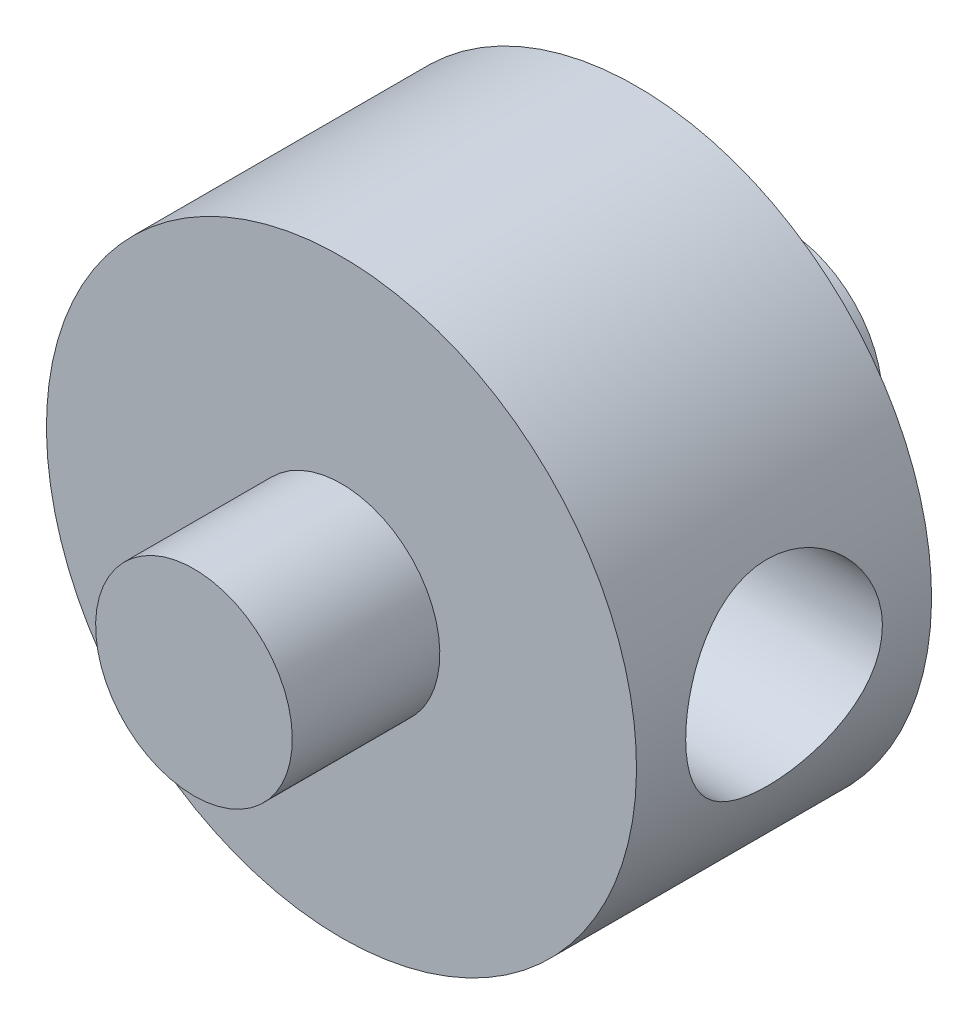
ISO-10303-21;
HEADER;
FILE_DESCRIPTION(('STEP AP214'),'2;1');
FILE_NAME('part.step','',(''),(''),'','','');
FILE_SCHEMA(('AUTOMOTIVE_DESIGN { 1 0 10303 214 1 1 1 1 }'));
ENDSEC;
DATA;
#1=APPLICATION_CONTEXT('core data for automotive mechanical design processes');
#2=APPLICATION_PROTOCOL_DEFINITION('international standard','automotive_design',2000,#1);
#3=PRODUCT_CONTEXT('',#1,'mechanical');
#4=PRODUCT('Part','Part','',(#3));
#5=PRODUCT_RELATED_PRODUCT_CATEGORY('part','',(#4));
#6=PRODUCT_DEFINITION_FORMATION('','',#4);
#7=PRODUCT_DEFINITION_CONTEXT('part definition',#1,'design');
#8=PRODUCT_DEFINITION('design','',#6,#7);
#9=PRODUCT_DEFINITION_SHAPE('','',#8);
#10=(LENGTH_UNIT() NAMED_UNIT(*) SI_UNIT(.MILLI.,.METRE.));
#11=(NAMED_UNIT(*) PLANE_ANGLE_UNIT() SI_UNIT($,.RADIAN.));
#12=(NAMED_UNIT(*) SI_UNIT($,.STERADIAN.) SOLID_ANGLE_UNIT());
#13=UNCERTAINTY_MEASURE_WITH_UNIT(LENGTH_MEASURE(1.E-05),#10,'distance_accuracy_value','');
#14=(GEOMETRIC_REPRESENTATION_CONTEXT(3) GLOBAL_UNCERTAINTY_ASSIGNED_CONTEXT((#13)) GLOBAL_UNIT_ASSIGNED_CONTEXT((#10,
#11,#12)) REPRESENTATION_CONTEXT('',''));
#15=CARTESIAN_POINT('',(0.,0.,0.));
#16=DIRECTION('',(0.,0.,1.));
#17=DIRECTION('',(1.,0.,0.));
#18=AXIS2_PLACEMENT_3D('',#15,#16,#17);
#19=CARTESIAN_POINT('',(0.,3.175,0.));
#20=DIRECTION('',(0.,0.,-1.));
#21=DIRECTION('',(0.,1.,0.));
#22=AXIS2_PLACEMENT_3D('',#19,#20,#21);
#23=PLANE('',#22);
#24=CARTESIAN_POINT('',(0.,0.,0.));
#25=DIRECTION('',(0.,0.,1.));
#26=DIRECTION('',(0.,-1.,0.));
#27=AXIS2_PLACEMENT_3D('',#24,#25,#26);
#28=CIRCLE('',#27,3.175);
#29=CARTESIAN_POINT('',(0.,-3.175,0.));
#30=VERTEX_POINT('',#29);
#31=EDGE_CURVE('E89',#30,#30,#28,.T.);
#32=ORIENTED_EDGE('',*,*,#31,.T.);
#33=EDGE_LOOP('',(#32));
#34=FACE_BOUND('',#33,.T.);
#35=ADVANCED_FACE('F31',(#34),#23,.F.);
#36=CARTESIAN_POINT('',(0.,0.,-19.05));
#37=DIRECTION('',(0.,0.,1.));
#38=DIRECTION('',(0.,-1.,0.));
#39=AXIS2_PLACEMENT_3D('',#36,#37,#38);
#40=PLANE('',#39);
#41=CARTESIAN_POINT('',(0.,0.,-19.05));
#42=DIRECTION('',(0.,0.,1.));
#43=DIRECTION('',(0.,-1.,0.));
#44=AXIS2_PLACEMENT_3D('',#41,#42,#43);
#45=CIRCLE('',#44,3.175);
#46=CARTESIAN_POINT('',(0.,-3.175,-19.05));
#47=VERTEX_POINT('',#46);
#48=EDGE_CURVE('E46',#47,#47,#45,.T.);
#49=ORIENTED_EDGE('',*,*,#48,.F.);
#50=EDGE_LOOP('',(#49));
#51=FACE_BOUND('',#50,.T.);
#52=ADVANCED_FACE('F80',(#51),#40,.F.);
#53=CARTESIAN_POINT('',(0.,0.,0.));
#54=DIRECTION('',(0.,0.,1.));
#55=DIRECTION('',(0.,-1.,0.));
#56=AXIS2_PLACEMENT_3D('',#53,#54,#55);
#57=CYLINDRICAL_SURFACE('',#56,3.175);
#58=CARTESIAN_POINT('',(0.,0.,-14.2875));
#59=DIRECTION('',(0.,0.,1.));
#60=DIRECTION('',(0.,-1.,0.));
#61=AXIS2_PLACEMENT_3D('',#58,#59,#60);
#62=CIRCLE('',#61,3.175);
#63=CARTESIAN_POINT('',(0.,-3.175,-14.2875));
#64=VERTEX_POINT('',#63);
#65=EDGE_CURVE('E50',#64,#64,#62,.T.);
#66=ORIENTED_EDGE('',*,*,#65,.F.);
#67=EDGE_LOOP('',(#66));
#68=FACE_BOUND('',#67,.T.);
#69=ORIENTED_EDGE('',*,*,#48,.T.);
#70=EDGE_LOOP('',(#69));
#71=FACE_BOUND('',#70,.T.);
#72=ADVANCED_FACE('F85',(#68,#71),#57,.T.);
#73=CARTESIAN_POINT('',(0.,3.175,-14.2875));
#74=DIRECTION('',(0.,0.,1.));
#75=DIRECTION('',(0.,-1.,0.));
#76=AXIS2_PLACEMENT_3D('',#73,#74,#75);
#77=PLANE('',#76);
#78=CARTESIAN_POINT('',(0.,0.,-14.2875));
#79=DIRECTION('',(0.,0.,1.));
#80=DIRECTION('',(0.,-1.,0.));
#81=AXIS2_PLACEMENT_3D('',#78,#79,#80);
#82=CIRCLE('',#81,9.525);
#83=CARTESIAN_POINT('',(0.,-9.525,-14.2875));
#84=VERTEX_POINT('',#83);
#85=EDGE_CURVE('E98',#84,#84,#82,.T.);
#86=ORIENTED_EDGE('',*,*,#85,.F.);
#87=EDGE_LOOP('',(#86));
#88=FACE_BOUND('',#87,.T.);
#89=ORIENTED_EDGE('',*,*,#65,.T.);
#90=EDGE_LOOP('',(#89));
#91=FACE_BOUND('',#90,.T.);
#92=ADVANCED_FACE('F76',(#88,#91),#77,.F.);
#93=CARTESIAN_POINT('',(0.,0.,0.));
#94=DIRECTION('',(0.,0.,1.));
#95=DIRECTION('',(0.,-1.,0.));
#96=AXIS2_PLACEMENT_3D('',#93,#94,#95);
#97=CYLINDRICAL_SURFACE('',#96,9.525);
#98=CARTESIAN_POINT('',(-9.525,0.,-12.7));
#99=CARTESIAN_POINT('',(-9.52500048580498,0.173238677165346,-12.700000805598));
#100=CARTESIAN_POINT('',(-9.52023018186455,0.346472492659896,-12.6857751550461));
#101=CARTESIAN_POINT('',(-9.50167042395416,0.687837590771687,-12.6294225795053));
#102=CARTESIAN_POINT('',(-9.48788003366834,0.855968341777247,-12.5872927579622));
#103=CARTESIAN_POINT('',(-9.45277852602955,1.18215660666814,-12.4767364022556));
#104=CARTESIAN_POINT('',(-9.43147998545459,1.34023044718816,-12.4083538266918));
#105=CARTESIAN_POINT('',(-9.3835361515256,1.64266542435691,-12.2474317762382));
#106=CARTESIAN_POINT('',(-9.35688980370195,1.78702384834389,-12.1548875361167));
#107=CARTESIAN_POINT('',(-9.30002249856541,2.0629298181957,-11.9449030695735));
#108=CARTESIAN_POINT('',(-9.26971591772517,2.19393674844713,-11.8267758312229));
#109=CARTESIAN_POINT('',(-9.2094149943641,2.43469379932912,-11.5704392838067));
#110=CARTESIAN_POINT('',(-9.17942072197493,2.54443923892904,-11.432225564102));
#111=CARTESIAN_POINT('',(-9.12219830615344,2.74264419157345,-11.1347722592512));
#112=CARTESIAN_POINT('',(-9.0950744970031,2.83040092485178,-10.9750423763505));
#113=CARTESIAN_POINT('',(-9.04796594704058,2.97757492456177,-10.6420409000941));
#114=CARTESIAN_POINT('',(-9.02797902810367,3.03700083920298,-10.4687734580083));
#115=CARTESIAN_POINT('',(-8.99830887880273,3.12379824029159,-10.1197625217479));
#116=CARTESIAN_POINT('',(-8.98830104068515,3.15218269826287,-9.94429936304722));
#117=CARTESIAN_POINT('',(-8.97876209798686,3.17925806658697,-9.59083758055508));
#118=CARTESIAN_POINT('',(-8.97922775597167,3.17795815259498,-9.41283975724832));
#119=CARTESIAN_POINT('',(-8.99029872650972,3.14648819425836,-9.06800119834023));
#120=CARTESIAN_POINT('',(-9.00043970379417,3.11764017430521,-8.90102232073211));
#121=CARTESIAN_POINT('',(-9.02895888275449,3.0340495670469,-8.5744258927483));
#122=CARTESIAN_POINT('',(-9.04733807064541,2.97930387942919,-8.41480922624365));
#123=CARTESIAN_POINT('',(-9.09059367841715,2.84460650934117,-8.10446452004705));
#124=CARTESIAN_POINT('',(-9.11556996393148,2.76426310464556,-7.95392101913425));
#125=CARTESIAN_POINT('',(-9.16916373477931,2.58092291251247,-7.66803486621187));
#126=CARTESIAN_POINT('',(-9.19778227084722,2.47791958175572,-7.53269662198651));
#127=CARTESIAN_POINT('',(-9.25726270107577,2.2458341312661,-7.27363417583954));
#128=CARTESIAN_POINT('',(-9.28816371201626,2.11567125149229,-7.1508851949337));
#129=CARTESIAN_POINT('',(-9.34742029378841,1.83622813465495,-6.92870322834371));
#130=CARTESIAN_POINT('',(-9.37577562033364,1.68694606622309,-6.82927247882772));
#131=CARTESIAN_POINT('',(-9.42711817702495,1.3714336714219,-6.65576424675365));
#132=CARTESIAN_POINT('',(-9.45004936275524,1.20504990262187,-6.58194806499317));
#133=CARTESIAN_POINT('',(-9.4875530068358,0.86127933968231,-6.46365492269061));
#134=CARTESIAN_POINT('',(-9.50212836854241,0.683896391141976,-6.41916777053058));
#135=CARTESIAN_POINT('',(-9.52079715951823,0.331418658755539,-6.36252326037901));
#136=CARTESIAN_POINT('',(-9.52531755822086,0.156557979570885,-6.34904810587651));
#137=CARTESIAN_POINT('',(-9.52464766056077,-0.192960847123756,-6.35105623867514));
#138=CARTESIAN_POINT('',(-9.51945900331475,-0.367619023839892,-6.36653463793611));
#139=CARTESIAN_POINT('',(-9.50023578476806,-0.706500575516014,-6.42496780706167));
#140=CARTESIAN_POINT('',(-9.48646180908036,-0.870879661700631,-6.46711370420714));
#141=CARTESIAN_POINT('',(-9.45171613685472,-1.19016766849015,-6.57667418618186));
#142=CARTESIAN_POINT('',(-9.43074352248193,-1.34507537851483,-6.64409199331022));
#143=CARTESIAN_POINT('',(-9.38304356837145,-1.64556534104864,-6.8042486210945));
#144=CARTESIAN_POINT('',(-9.35617936849621,-1.79079512051444,-6.89760683367407));
#145=CARTESIAN_POINT('',(-9.29974181184133,-2.06395583568049,-7.10626642629281));
#146=CARTESIAN_POINT('',(-9.27016762910402,-2.19188146775096,-7.22157450790085));
#147=CARTESIAN_POINT('',(-9.20993992337912,-2.432851712285,-7.47705753444592));
#148=CARTESIAN_POINT('',(-9.17929841452584,-2.54495607735532,-7.61812429549278));
#149=CARTESIAN_POINT('',(-9.121774152107,-2.74401763337735,-7.91772472779957));
#150=CARTESIAN_POINT('',(-9.09489142987857,-2.83097461468097,-8.07625854466319));
#151=CARTESIAN_POINT('',(-9.04819093937642,-2.97687025407195,-8.40636182354542));
#152=CARTESIAN_POINT('',(-9.02835890517707,-3.03586556962394,-8.57790410136083));
#153=CARTESIAN_POINT('',(-8.99829392572977,-3.12386556696096,-8.92930221389011));
#154=CARTESIAN_POINT('',(-8.98805665630055,-3.15288375947876,-9.10915426515881));
#155=CARTESIAN_POINT('',(-8.97883201925512,-3.17905219686556,-9.46212577992991));
#156=CARTESIAN_POINT('',(-8.97929370817293,-3.17776306695417,-9.63511643041066));
#157=CARTESIAN_POINT('',(-8.99005281690779,-3.1471942816996,-9.97827911287755));
#158=CARTESIAN_POINT('',(-9.00034965132723,-3.11791629228101,-10.1484513120074));
#159=CARTESIAN_POINT('',(-9.02920864668031,-3.03330550668567,-10.4779307300329));
#160=CARTESIAN_POINT('',(-9.04761011221366,-2.97847812359926,-10.6373829193893));
#161=CARTESIAN_POINT('',(-9.09054566248637,-2.8447344862872,-10.944947017029));
#162=CARTESIAN_POINT('',(-9.11508110823773,-2.76581288515833,-11.0930563990219));
#163=CARTESIAN_POINT('',(-9.16885482792697,-2.58210269895239,-11.3807356520052));
#164=CARTESIAN_POINT('',(-9.19825159463785,-2.47633567077754,-11.5196508935274));
#165=CARTESIAN_POINT('',(-9.25777156199328,-2.24359115395568,-11.7782651574948));
#166=CARTESIAN_POINT('',(-9.28789496596782,-2.11660766813345,-11.8979587278096));
#167=CARTESIAN_POINT('',(-9.34688346918602,-1.83909194322318,-12.1194335090181));
#168=CARTESIAN_POINT('',(-9.3756537721899,-1.68783480536164,-12.2203348041094));
#169=CARTESIAN_POINT('',(-9.42740021973043,-1.36955960976603,-12.3951696116008));
#170=CARTESIAN_POINT('',(-9.45037784507677,-1.2025455950702,-12.4691100183025));
#171=CARTESIAN_POINT('',(-9.4870751034262,-0.865167329863096,-12.5848161831515));
#172=CARTESIAN_POINT('',(-9.50116249441509,-0.695286130622596,-12.6278718303862));
#173=CARTESIAN_POINT('',(-9.52012342428904,-0.350267320832533,-12.6854593911499));
#174=CARTESIAN_POINT('',(-9.52499950888798,-0.175131176180769,-12.6999991856015));
#175=CARTESIAN_POINT('',(-9.525,0.,-12.7));
#176=B_SPLINE_CURVE_WITH_KNOTS('',3,(#98,#99,#100,#101,#102,#103,#104,#105,#106,#107,#108,#109,
#110,#111,#112,#113,#114,#115,#116,#117,#118,#119,#120,#121,#122,#123,#124,#125,#126,#127,#128,
#129,#130,#131,#132,#133,#134,#135,#136,#137,#138,#139,#140,#141,#142,#143,#144,#145,#146,#147,
#148,#149,#150,#151,#152,#153,#154,#155,#156,#157,#158,#159,#160,#161,#162,#163,#164,#165,#166,
#167,#168,#169,#170,#171,#172,#173,#174,#175),.UNSPECIFIED.,.T.,.F.,(4,2,2,2,2,2,2,2,2,2,2,2,2,
2,2,2,2,2,2,2,2,2,2,2,2,2,2,2,2,2,2,2,2,2,2,2,2,2,4),(0.,0.519071561632585,1.03819701322438,
1.55645698636312,2.07481924951214,2.6093637259775,3.14402575687909,3.69406121814519,
4.24392866899746,4.77526114230342,5.30642937910267,5.81332424300315,6.32027980466156,
6.8353994341754,7.35066800622308,7.8928374595109,8.43505888444014,8.98265937939886,
9.53006948685137,10.0537512658116,10.5773446429626,11.0857715158083,11.5942632377703,
12.1161301950386,12.638156741095,13.1839024764639,13.7296527614611,14.274292439,
14.8186865394104,15.3351123975402,15.8515075194062,16.3580948898033,16.8647947620873,
17.3936046174648,17.92256420318,18.4721392315144,19.0215736265905,19.5464607283686,
20.0712027467109),.UNSPECIFIED.);
#177=CARTESIAN_POINT('',(-9.525,0.,-12.7));
#178=VERTEX_POINT('',#177);
#179=EDGE_CURVE('E10',#178,#178,#176,.T.);
#180=ORIENTED_EDGE('',*,*,#179,.T.);
#181=EDGE_LOOP('',(#180));
#182=FACE_BOUND('',#181,.T.);
#183=CARTESIAN_POINT('',(9.52499999999999,0.,-12.7));
#184=CARTESIAN_POINT('',(9.52500048580497,-0.173238677165346,-12.700000805598));
#185=CARTESIAN_POINT('',(9.52023018186454,-0.346472492659896,-12.6857751550461));
#186=CARTESIAN_POINT('',(9.50167042395416,-0.687837590771688,-12.6294225795053));
#187=CARTESIAN_POINT('',(9.48788003366834,-0.855968341777248,-12.5872927579622));
#188=CARTESIAN_POINT('',(9.45277852602955,-1.18215660666814,-12.4767364022556));
#189=CARTESIAN_POINT('',(9.43147998545459,-1.34023044718816,-12.4083538266918));
#190=CARTESIAN_POINT('',(9.3835361515256,-1.64266542435691,-12.2474317762382));
#191=CARTESIAN_POINT('',(9.35688980370195,-1.78702384834389,-12.1548875361167));
#192=CARTESIAN_POINT('',(9.30002249856541,-2.0629298181957,-11.9449030695735));
#193=CARTESIAN_POINT('',(9.26971591772517,-2.19393674844714,-11.8267758312229));
#194=CARTESIAN_POINT('',(9.2094149943641,-2.43469379932912,-11.5704392838066));
#195=CARTESIAN_POINT('',(9.17942072197493,-2.54443923892905,-11.432225564102));
#196=CARTESIAN_POINT('',(9.12219830615344,-2.74264419157345,-11.1347722592512));
#197=CARTESIAN_POINT('',(9.0950744970031,-2.83040092485178,-10.9750423763505));
#198=CARTESIAN_POINT('',(9.04796594704058,-2.97757492456177,-10.6420409000941));
#199=CARTESIAN_POINT('',(9.02797902810367,-3.03700083920298,-10.4687734580083));
#200=CARTESIAN_POINT('',(8.99830887880273,-3.1237982402916,-10.1197625217479));
#201=CARTESIAN_POINT('',(8.98830104068515,-3.15218269826287,-9.94429936304722));
#202=CARTESIAN_POINT('',(8.97876209798686,-3.17925806658697,-9.59083758055507));
#203=CARTESIAN_POINT('',(8.97922775597167,-3.17795815259498,-9.41283975724832));
#204=CARTESIAN_POINT('',(8.99029872650972,-3.14648819425836,-9.06800119834023));
#205=CARTESIAN_POINT('',(9.00043970379417,-3.11764017430521,-8.90102232073211));
#206=CARTESIAN_POINT('',(9.02895888275449,-3.0340495670469,-8.5744258927483));
#207=CARTESIAN_POINT('',(9.04733807064541,-2.97930387942919,-8.41480922624365));
#208=CARTESIAN_POINT('',(9.09059367841715,-2.84460650934117,-8.10446452004705));
#209=CARTESIAN_POINT('',(9.11556996393147,-2.76426310464556,-7.95392101913425));
#210=CARTESIAN_POINT('',(9.16916373477931,-2.58092291251247,-7.66803486621187));
#211=CARTESIAN_POINT('',(9.19778227084722,-2.47791958175572,-7.53269662198651));
#212=CARTESIAN_POINT('',(9.25726270107577,-2.2458341312661,-7.27363417583954));
#213=CARTESIAN_POINT('',(9.28816371201626,-2.11567125149229,-7.1508851949337));
#214=CARTESIAN_POINT('',(9.34742029378841,-1.83622813465495,-6.92870322834371));
#215=CARTESIAN_POINT('',(9.37577562033364,-1.68694606622309,-6.82927247882772));
#216=CARTESIAN_POINT('',(9.42711817702495,-1.3714336714219,-6.65576424675366));
#217=CARTESIAN_POINT('',(9.45004936275524,-1.20504990262187,-6.58194806499317));
#218=CARTESIAN_POINT('',(9.4875530068358,-0.861279339682313,-6.46365492269062));
#219=CARTESIAN_POINT('',(9.50212836854241,-0.683896391141979,-6.41916777053058));
#220=CARTESIAN_POINT('',(9.52079715951823,-0.331418658755541,-6.36252326037901));
#221=CARTESIAN_POINT('',(9.52531755822086,-0.156557979570887,-6.34904810587651));
#222=CARTESIAN_POINT('',(9.52464766056077,0.192960847123753,-6.35105623867514));
#223=CARTESIAN_POINT('',(9.51945900331475,0.36761902383989,-6.36653463793611));
#224=CARTESIAN_POINT('',(9.50023578476806,0.706500575516011,-6.42496780706167));
#225=CARTESIAN_POINT('',(9.48646180908036,0.870879661700628,-6.46711370420714));
#226=CARTESIAN_POINT('',(9.45171613685472,1.19016766849015,-6.57667418618186));
#227=CARTESIAN_POINT('',(9.43074352248193,1.34507537851483,-6.64409199331022));
#228=CARTESIAN_POINT('',(9.38304356837145,1.64556534104864,-6.80424862109449));
#229=CARTESIAN_POINT('',(9.35617936849621,1.79079512051444,-6.89760683367407));
#230=CARTESIAN_POINT('',(9.29974181184133,2.06395583568049,-7.10626642629281));
#231=CARTESIAN_POINT('',(9.27016762910402,2.19188146775096,-7.22157450790085));
#232=CARTESIAN_POINT('',(9.20993992337912,2.432851712285,-7.47705753444592));
#233=CARTESIAN_POINT('',(9.17929841452584,2.54495607735532,-7.61812429549278));
#234=CARTESIAN_POINT('',(9.121774152107,2.74401763337735,-7.91772472779957));
#235=CARTESIAN_POINT('',(9.09489142987857,2.83097461468097,-8.07625854466319));
#236=CARTESIAN_POINT('',(9.04819093937642,2.97687025407195,-8.40636182354542));
#237=CARTESIAN_POINT('',(9.02835890517707,3.03586556962394,-8.57790410136083));
#238=CARTESIAN_POINT('',(8.99829392572977,3.12386556696096,-8.92930221389011));
#239=CARTESIAN_POINT('',(8.98805665630055,3.15288375947876,-9.10915426515881));
#240=CARTESIAN_POINT('',(8.97883201925512,3.17905219686556,-9.46212577992991));
#241=CARTESIAN_POINT('',(8.97929370817293,3.17776306695417,-9.63511643041066));
#242=CARTESIAN_POINT('',(8.99005281690779,3.1471942816996,-9.97827911287755));
#243=CARTESIAN_POINT('',(9.00034965132723,3.11791629228101,-10.1484513120074));
#244=CARTESIAN_POINT('',(9.02920864668031,3.03330550668567,-10.4779307300329));
#245=CARTESIAN_POINT('',(9.04761011221366,2.97847812359926,-10.6373829193893));
#246=CARTESIAN_POINT('',(9.09054566248638,2.8447344862872,-10.944947017029));
#247=CARTESIAN_POINT('',(9.11508110823773,2.76581288515833,-11.0930563990219));
#248=CARTESIAN_POINT('',(9.16885482792697,2.58210269895239,-11.3807356520052));
#249=CARTESIAN_POINT('',(9.19825159463785,2.47633567077754,-11.5196508935274));
#250=CARTESIAN_POINT('',(9.25777156199328,2.24359115395568,-11.7782651574948));
#251=CARTESIAN_POINT('',(9.28789496596782,2.11660766813345,-11.8979587278096));
#252=CARTESIAN_POINT('',(9.34688346918603,1.83909194322319,-12.1194335090181));
#253=CARTESIAN_POINT('',(9.3756537721899,1.68783480536164,-12.2203348041094));
#254=CARTESIAN_POINT('',(9.42740021973043,1.36955960976603,-12.3951696116008));
#255=CARTESIAN_POINT('',(9.45037784507677,1.20254559507021,-12.4691100183025));
#256=CARTESIAN_POINT('',(9.4870751034262,0.8651673298631,-12.5848161831515));
#257=CARTESIAN_POINT('',(9.50116249441509,0.6952861306226,-12.6278718303862));
#258=CARTESIAN_POINT('',(9.52012342428904,0.350267320832536,-12.6854593911499));
#259=CARTESIAN_POINT('',(9.52499950888797,0.175131176180771,-12.6999991856015));
#260=CARTESIAN_POINT('',(9.52499999999999,0.,-12.7));
#261=B_SPLINE_CURVE_WITH_KNOTS('',3,(#183,#184,#185,#186,#187,#188,#189,#190,#191,#192,#193,
#194,#195,#196,#197,#198,#199,#200,#201,#202,#203,#204,#205,#206,#207,#208,#209,#210,#211,#212,
#213,#214,#215,#216,#217,#218,#219,#220,#221,#222,#223,#224,#225,#226,#227,#228,#229,#230,#231,
#232,#233,#234,#235,#236,#237,#238,#239,#240,#241,#242,#243,#244,#245,#246,#247,#248,#249,#250,
#251,#252,#253,#254,#255,#256,#257,#258,#259,#260),.UNSPECIFIED.,.T.,.F.,(4,2,2,2,2,2,2,2,2,2,2,
2,2,2,2,2,2,2,2,2,2,2,2,2,2,2,2,2,2,2,2,2,2,2,2,2,2,2,4),(0.,0.519071561632586,1.03819701322438,
1.55645698636312,2.07481924951215,2.60936372597751,3.14402575687909,3.69406121814519,
4.24392866899746,4.77526114230343,5.30642937910267,5.81332424300315,6.32027980466156,
6.8353994341754,7.35066800622308,7.8928374595109,8.43505888444014,8.98265937939886,
9.53006948685137,10.0537512658116,10.5773446429626,11.0857715158083,11.5942632377703,
12.1161301950386,12.6381567410951,13.1839024764639,13.7296527614612,14.274292439,
14.8186865394104,15.3351123975402,15.8515075194062,16.3580948898033,16.8647947620873,
17.3936046174648,17.92256420318,18.4721392315145,19.0215736265905,19.5464607283686,
20.0712027467109),.UNSPECIFIED.);
#262=CARTESIAN_POINT('',(9.52499999999999,0.,-12.7));
#263=VERTEX_POINT('',#262);
#264=EDGE_CURVE('E42',#263,#263,#261,.T.);
#265=ORIENTED_EDGE('',*,*,#264,.T.);
#266=EDGE_LOOP('',(#265));
#267=FACE_BOUND('',#266,.T.);
#268=CARTESIAN_POINT('',(0.,0.,-4.7625));
#269=DIRECTION('',(0.,0.,1.));
#270=DIRECTION('',(0.,-1.,0.));
#271=AXIS2_PLACEMENT_3D('',#268,#269,#270);
#272=CIRCLE('',#271,9.525);
#273=CARTESIAN_POINT('',(0.,-9.525,-4.7625));
#274=VERTEX_POINT('',#273);
#275=EDGE_CURVE('E93',#274,#274,#272,.T.);
#276=ORIENTED_EDGE('',*,*,#275,.F.);
#277=EDGE_LOOP('',(#276));
#278=FACE_BOUND('',#277,.T.);
#279=ORIENTED_EDGE('',*,*,#85,.T.);
#280=EDGE_LOOP('',(#279));
#281=FACE_BOUND('',#280,.T.);
#282=ADVANCED_FACE('F56',(#182,#267,#278,#281),#97,.T.);
#283=CARTESIAN_POINT('',(0.,9.525,-4.7625));
#284=DIRECTION('',(0.,0.,-1.));
#285=DIRECTION('',(0.,1.,0.));
#286=AXIS2_PLACEMENT_3D('',#283,#284,#285);
#287=PLANE('',#286);
#288=CARTESIAN_POINT('',(0.,0.,-4.7625));
#289=DIRECTION('',(0.,0.,1.));
#290=DIRECTION('',(0.,-1.,0.));
#291=AXIS2_PLACEMENT_3D('',#288,#289,#290);
#292=CIRCLE('',#291,3.175);
#293=CARTESIAN_POINT('',(0.,-3.175,-4.7625));
#294=VERTEX_POINT('',#293);
#295=EDGE_CURVE('E90',#294,#294,#292,.T.);
#296=ORIENTED_EDGE('',*,*,#295,.F.);
#297=EDGE_LOOP('',(#296));
#298=FACE_BOUND('',#297,.T.);
#299=ORIENTED_EDGE('',*,*,#275,.T.);
#300=EDGE_LOOP('',(#299));
#301=FACE_BOUND('',#300,.T.);
#302=ADVANCED_FACE('F68',(#298,#301),#287,.F.);
#303=CARTESIAN_POINT('',(0.,0.,0.));
#304=DIRECTION('',(0.,0.,1.));
#305=DIRECTION('',(0.,-1.,0.));
#306=AXIS2_PLACEMENT_3D('',#303,#304,#305);
#307=CYLINDRICAL_SURFACE('',#306,3.175);
#308=ORIENTED_EDGE('',*,*,#31,.F.);
#309=EDGE_LOOP('',(#308));
#310=FACE_BOUND('',#309,.T.);
#311=ORIENTED_EDGE('',*,*,#295,.T.);
#312=EDGE_LOOP('',(#311));
#313=FACE_BOUND('',#312,.T.);
#314=ADVANCED_FACE('F64',(#310,#313),#307,.T.);
#315=CARTESIAN_POINT('',(-9.525,0.,-9.525));
#316=DIRECTION('',(1.,0.,0.));
#317=DIRECTION('',(0.,0.,-1.));
#318=AXIS2_PLACEMENT_3D('',#315,#316,#317);
#319=CYLINDRICAL_SURFACE('',#318,3.175);
#320=ORIENTED_EDGE('',*,*,#264,.F.);
#321=EDGE_LOOP('',(#320));
#322=FACE_BOUND('',#321,.T.);
#323=ORIENTED_EDGE('',*,*,#179,.F.);
#324=EDGE_LOOP('',(#323));
#325=FACE_BOUND('',#324,.T.);
#326=ADVANCED_FACE('F60',(#322,#325),#319,.F.);
#327=CLOSED_SHELL('',(#35,#52,#72,#92,#282,#302,#314,#326));
#328=MANIFOLD_SOLID_BREP('B2',#327);
#329=ADVANCED_BREP_SHAPE_REPRESENTATION('',(#18,#328),#14);
#330=SHAPE_DEFINITION_REPRESENTATION(#9,#329);
ENDSEC;
END-ISO-10303-21;
